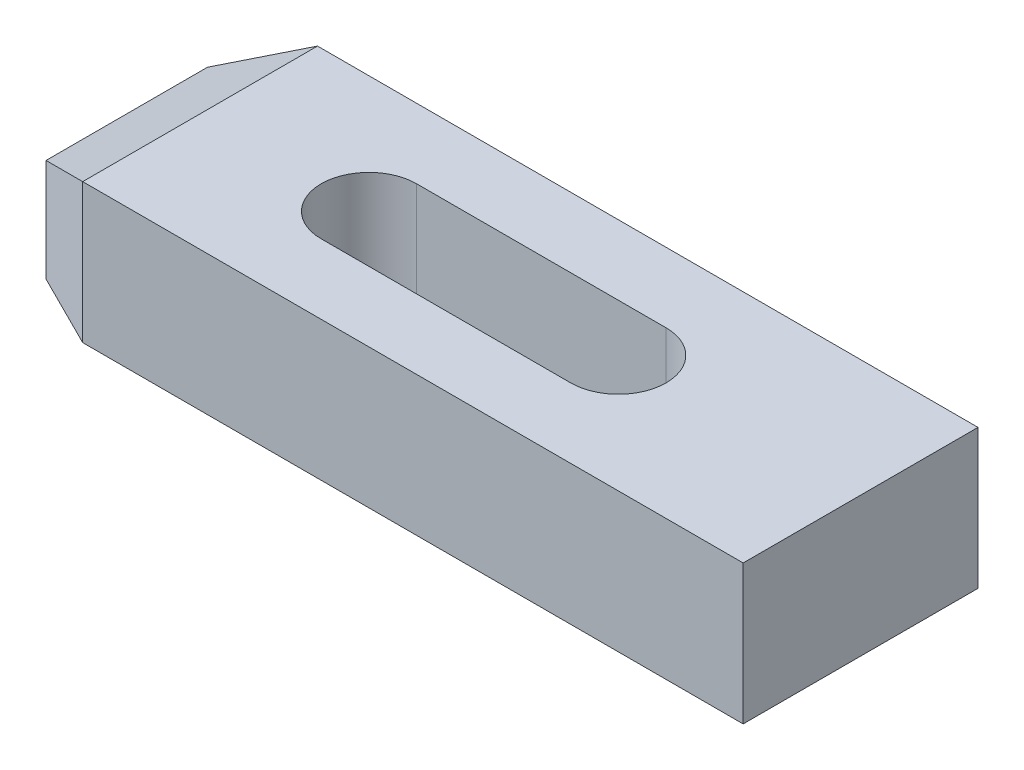
ISO-10303-21;
HEADER;
FILE_DESCRIPTION(('STEP AP214'),'2;1');
FILE_NAME('part.step','',(''),(''),'','','');
FILE_SCHEMA(('AUTOMOTIVE_DESIGN { 1 0 10303 214 1 1 1 1 }'));
ENDSEC;
DATA;
#1=APPLICATION_CONTEXT('core data for automotive mechanical design processes');
#2=APPLICATION_PROTOCOL_DEFINITION('international standard','automotive_design',2000,#1);
#3=PRODUCT_CONTEXT('',#1,'mechanical');
#4=PRODUCT('Part','Part','',(#3));
#5=PRODUCT_RELATED_PRODUCT_CATEGORY('part','',(#4));
#6=PRODUCT_DEFINITION_FORMATION('','',#4);
#7=PRODUCT_DEFINITION_CONTEXT('part definition',#1,'design');
#8=PRODUCT_DEFINITION('design','',#6,#7);
#9=PRODUCT_DEFINITION_SHAPE('','',#8);
#10=(LENGTH_UNIT() NAMED_UNIT(*) SI_UNIT(.MILLI.,.METRE.));
#11=(NAMED_UNIT(*) PLANE_ANGLE_UNIT() SI_UNIT($,.RADIAN.));
#12=(NAMED_UNIT(*) SI_UNIT($,.STERADIAN.) SOLID_ANGLE_UNIT());
#13=UNCERTAINTY_MEASURE_WITH_UNIT(LENGTH_MEASURE(1.E-05),#10,'distance_accuracy_value','');
#14=(GEOMETRIC_REPRESENTATION_CONTEXT(3) GLOBAL_UNCERTAINTY_ASSIGNED_CONTEXT((#13)) GLOBAL_UNIT_ASSIGNED_CONTEXT((#10,
#11,#12)) REPRESENTATION_CONTEXT('',''));
#15=CARTESIAN_POINT('',(0.,0.,0.));
#16=DIRECTION('',(0.,0.,1.));
#17=DIRECTION('',(1.,0.,0.));
#18=AXIS2_PLACEMENT_3D('',#15,#16,#17);
#19=CARTESIAN_POINT('',(0.,19.,0.));
#20=DIRECTION('',(0.,-1.,0.));
#21=DIRECTION('',(0.,0.,-1.));
#22=AXIS2_PLACEMENT_3D('',#19,#20,#21);
#23=PLANE('',#22);
#24=DIRECTION('',(-1.,0.,0.));
#25=VECTOR('',#24,1.);
#26=CARTESIAN_POINT('',(-40.,19.,-16.));
#27=LINE('',#26,#25);
#28=CARTESIAN_POINT('',(50.,19.,-16.));
#29=VERTEX_POINT('',#28);
#30=CARTESIAN_POINT('',(-40.,19.,-16.));
#31=VERTEX_POINT('',#30);
#32=EDGE_CURVE('E135',#29,#31,#27,.T.);
#33=ORIENTED_EDGE('',*,*,#32,.T.);
#34=DIRECTION('',(0.,0.,1.));
#35=VECTOR('',#34,1.);
#36=CARTESIAN_POINT('',(-40.,19.,-16.));
#37=LINE('',#36,#35);
#38=CARTESIAN_POINT('',(-40.,19.,16.));
#39=VERTEX_POINT('',#38);
#40=EDGE_CURVE('E115',#31,#39,#37,.T.);
#41=ORIENTED_EDGE('',*,*,#40,.T.);
#42=DIRECTION('',(1.,0.,0.));
#43=VECTOR('',#42,1.);
#44=CARTESIAN_POINT('',(-39.9999999999999,19.,16.));
#45=LINE('',#44,#43);
#46=CARTESIAN_POINT('',(50.,19.,16.));
#47=VERTEX_POINT('',#46);
#48=EDGE_CURVE('E142',#39,#47,#45,.T.);
#49=ORIENTED_EDGE('',*,*,#48,.T.);
#50=DIRECTION('',(0.,0.,-1.));
#51=VECTOR('',#50,1.);
#52=CARTESIAN_POINT('',(50.,19.,16.));
#53=LINE('',#52,#51);
#54=EDGE_CURVE('E138',#47,#29,#53,.T.);
#55=ORIENTED_EDGE('',*,*,#54,.T.);
#56=EDGE_LOOP('',(#33,#41,#49,#55));
#57=FACE_BOUND('',#56,.T.);
#58=CARTESIAN_POINT('',(-17.,19.,0.));
#59=DIRECTION('',(0.,1.,0.));
#60=DIRECTION('',(0.,0.,1.));
#61=AXIS2_PLACEMENT_3D('',#58,#59,#60);
#62=CIRCLE('',#61,6.5);
#63=CARTESIAN_POINT('',(-17.,19.,-6.5));
#64=VERTEX_POINT('',#63);
#65=CARTESIAN_POINT('',(-17.,19.,6.5));
#66=VERTEX_POINT('',#65);
#67=EDGE_CURVE('E185',#64,#66,#62,.T.);
#68=ORIENTED_EDGE('',*,*,#67,.F.);
#69=DIRECTION('',(-1.,0.,0.));
#70=VECTOR('',#69,1.);
#71=CARTESIAN_POINT('',(-17.,19.,-6.5));
#72=LINE('',#71,#70);
#73=CARTESIAN_POINT('',(17.,19.,-6.50000000000001));
#74=VERTEX_POINT('',#73);
#75=EDGE_CURVE('E181',#74,#64,#72,.T.);
#76=ORIENTED_EDGE('',*,*,#75,.F.);
#77=CARTESIAN_POINT('',(17.,19.,0.));
#78=DIRECTION('',(0.,1.,0.));
#79=DIRECTION('',(0.,0.,1.));
#80=AXIS2_PLACEMENT_3D('',#77,#78,#79);
#81=CIRCLE('',#80,6.5);
#82=CARTESIAN_POINT('',(17.,19.,6.49999999999999));
#83=VERTEX_POINT('',#82);
#84=EDGE_CURVE('E195',#83,#74,#81,.T.);
#85=ORIENTED_EDGE('',*,*,#84,.F.);
#86=DIRECTION('',(1.,0.,0.));
#87=VECTOR('',#86,1.);
#88=CARTESIAN_POINT('',(-17.,19.,6.5));
#89=LINE('',#88,#87);
#90=EDGE_CURVE('E197',#66,#83,#89,.T.);
#91=ORIENTED_EDGE('',*,*,#90,.F.);
#92=EDGE_LOOP('',(#68,#76,#85,#91));
#93=FACE_BOUND('',#92,.T.);
#94=ADVANCED_FACE('F41',(#57,#93),#23,.F.);
#95=CARTESIAN_POINT('',(0.,0.,0.));
#96=DIRECTION('',(0.,-1.,0.));
#97=DIRECTION('',(0.,0.,-1.));
#98=AXIS2_PLACEMENT_3D('',#95,#96,#97);
#99=PLANE('',#98);
#100=DIRECTION('',(0.,0.,-1.));
#101=VECTOR('',#100,1.);
#102=CARTESIAN_POINT('',(50.,0.,16.));
#103=LINE('',#102,#101);
#104=CARTESIAN_POINT('',(50.,0.,16.));
#105=VERTEX_POINT('',#104);
#106=CARTESIAN_POINT('',(50.,0.,-16.));
#107=VERTEX_POINT('',#106);
#108=EDGE_CURVE('E167',#105,#107,#103,.T.);
#109=ORIENTED_EDGE('',*,*,#108,.F.);
#110=DIRECTION('',(1.,0.,0.));
#111=VECTOR('',#110,1.);
#112=CARTESIAN_POINT('',(-39.9999999999999,0.,16.));
#113=LINE('',#112,#111);
#114=CARTESIAN_POINT('',(-39.9999999999999,0.,16.));
#115=VERTEX_POINT('',#114);
#116=EDGE_CURVE('E157',#115,#105,#113,.T.);
#117=ORIENTED_EDGE('',*,*,#116,.F.);
#118=DIRECTION('',(0.894427190999916,0.,0.447213595499957));
#119=VECTOR('',#118,1.);
#120=CARTESIAN_POINT('',(-39.9999999999999,0.,16.));
#121=LINE('',#120,#119);
#122=CARTESIAN_POINT('',(-50.,0.,11.));
#123=VERTEX_POINT('',#122);
#124=EDGE_CURVE('E159',#123,#115,#121,.T.);
#125=ORIENTED_EDGE('',*,*,#124,.F.);
#126=DIRECTION('',(0.,0.,1.));
#127=VECTOR('',#126,1.);
#128=CARTESIAN_POINT('',(-50.,0.,11.));
#129=LINE('',#128,#127);
#130=CARTESIAN_POINT('',(-50.,0.,-11.));
#131=VERTEX_POINT('',#130);
#132=EDGE_CURVE('E161',#131,#123,#129,.T.);
#133=ORIENTED_EDGE('',*,*,#132,.F.);
#134=DIRECTION('',(-0.894427190999916,0.,0.447213595499958));
#135=VECTOR('',#134,1.);
#136=CARTESIAN_POINT('',(-40.,0.,-16.));
#137=LINE('',#136,#135);
#138=CARTESIAN_POINT('',(-40.,0.,-16.));
#139=VERTEX_POINT('',#138);
#140=EDGE_CURVE('E164',#139,#131,#137,.T.);
#141=ORIENTED_EDGE('',*,*,#140,.F.);
#142=DIRECTION('',(-1.,0.,0.));
#143=VECTOR('',#142,1.);
#144=CARTESIAN_POINT('',(-40.,0.,-16.));
#145=LINE('',#144,#143);
#146=EDGE_CURVE('E145',#107,#139,#145,.T.);
#147=ORIENTED_EDGE('',*,*,#146,.F.);
#148=EDGE_LOOP('',(#109,#117,#125,#133,#141,#147));
#149=FACE_BOUND('',#148,.T.);
#150=DIRECTION('',(-1.,0.,0.));
#151=VECTOR('',#150,1.);
#152=CARTESIAN_POINT('',(-17.,0.,-6.5));
#153=LINE('',#152,#151);
#154=CARTESIAN_POINT('',(17.,0.,-6.50000000000001));
#155=VERTEX_POINT('',#154);
#156=CARTESIAN_POINT('',(-17.,0.,-6.5));
#157=VERTEX_POINT('',#156);
#158=EDGE_CURVE('E182',#155,#157,#153,.T.);
#159=ORIENTED_EDGE('',*,*,#158,.T.);
#160=CARTESIAN_POINT('',(-17.,0.,0.));
#161=DIRECTION('',(0.,1.,0.));
#162=DIRECTION('',(0.,0.,1.));
#163=AXIS2_PLACEMENT_3D('',#160,#161,#162);
#164=CIRCLE('',#163,6.5);
#165=CARTESIAN_POINT('',(-17.,0.,6.5));
#166=VERTEX_POINT('',#165);
#167=EDGE_CURVE('E132',#157,#166,#164,.T.);
#168=ORIENTED_EDGE('',*,*,#167,.T.);
#169=DIRECTION('',(1.,0.,0.));
#170=VECTOR('',#169,1.);
#171=CARTESIAN_POINT('',(-17.,0.,6.5));
#172=LINE('',#171,#170);
#173=CARTESIAN_POINT('',(17.,0.,6.49999999999999));
#174=VERTEX_POINT('',#173);
#175=EDGE_CURVE('E189',#166,#174,#172,.T.);
#176=ORIENTED_EDGE('',*,*,#175,.T.);
#177=CARTESIAN_POINT('',(17.,0.,0.));
#178=DIRECTION('',(0.,1.,0.));
#179=DIRECTION('',(0.,0.,1.));
#180=AXIS2_PLACEMENT_3D('',#177,#178,#179);
#181=CIRCLE('',#180,6.5);
#182=EDGE_CURVE('E186',#174,#155,#181,.T.);
#183=ORIENTED_EDGE('',*,*,#182,.T.);
#184=EDGE_LOOP('',(#159,#168,#176,#183));
#185=FACE_BOUND('',#184,.T.);
#186=ADVANCED_FACE('F215',(#149,#185),#99,.T.);
#187=CARTESIAN_POINT('',(50.,19.,16.));
#188=DIRECTION('',(-1.,0.,0.));
#189=DIRECTION('',(0.,0.,1.));
#190=AXIS2_PLACEMENT_3D('',#187,#188,#189);
#191=PLANE('',#190);
#192=ORIENTED_EDGE('',*,*,#108,.T.);
#193=DIRECTION('',(0.,-1.,0.));
#194=VECTOR('',#193,1.);
#195=CARTESIAN_POINT('',(50.,19.,-16.));
#196=LINE('',#195,#194);
#197=EDGE_CURVE('E49',#29,#107,#196,.T.);
#198=ORIENTED_EDGE('',*,*,#197,.F.);
#199=ORIENTED_EDGE('',*,*,#54,.F.);
#200=DIRECTION('',(0.,-1.,0.));
#201=VECTOR('',#200,1.);
#202=CARTESIAN_POINT('',(50.,19.,16.));
#203=LINE('',#202,#201);
#204=EDGE_CURVE('E154',#47,#105,#203,.T.);
#205=ORIENTED_EDGE('',*,*,#204,.T.);
#206=EDGE_LOOP('',(#192,#198,#199,#205));
#207=FACE_BOUND('',#206,.T.);
#208=ADVANCED_FACE('F43',(#207),#191,.F.);
#209=CARTESIAN_POINT('',(-40.,19.,-16.));
#210=DIRECTION('',(0.,0.,1.));
#211=DIRECTION('',(1.,0.,0.));
#212=AXIS2_PLACEMENT_3D('',#209,#210,#211);
#213=PLANE('',#212);
#214=ORIENTED_EDGE('',*,*,#146,.T.);
#215=DIRECTION('',(0.,-1.,0.));
#216=VECTOR('',#215,1.);
#217=CARTESIAN_POINT('',(-40.,19.,-16.));
#218=LINE('',#217,#216);
#219=EDGE_CURVE('E129',#31,#139,#218,.T.);
#220=ORIENTED_EDGE('',*,*,#219,.F.);
#221=ORIENTED_EDGE('',*,*,#32,.F.);
#222=ORIENTED_EDGE('',*,*,#197,.T.);
#223=EDGE_LOOP('',(#214,#220,#221,#222));
#224=FACE_BOUND('',#223,.T.);
#225=ADVANCED_FACE('F144',(#224),#213,.F.);
#226=CARTESIAN_POINT('',(-40.,19.,-16.));
#227=DIRECTION('',(0.447213595499958,0.,0.894427190999916));
#228=DIRECTION('',(0.894427190999916,0.,-0.447213595499958));
#229=AXIS2_PLACEMENT_3D('',#226,#227,#228);
#230=PLANE('',#229);
#231=DIRECTION('',(0.,-1.,0.));
#232=VECTOR('',#231,1.);
#233=CARTESIAN_POINT('',(-50.,19.,-11.));
#234=LINE('',#233,#232);
#235=CARTESIAN_POINT('',(-50.,14.,-11.));
#236=VERTEX_POINT('',#235);
#237=EDGE_CURVE('E131',#236,#131,#234,.T.);
#238=ORIENTED_EDGE('',*,*,#237,.F.);
#239=DIRECTION('',(0.816496580927726,0.408248290463863,-0.408248290463864));
#240=VECTOR('',#239,1.);
#241=CARTESIAN_POINT('',(-40.,19.,-16.));
#242=LINE('',#241,#240);
#243=EDGE_CURVE('E118',#236,#31,#242,.T.);
#244=ORIENTED_EDGE('',*,*,#243,.T.);
#245=ORIENTED_EDGE('',*,*,#219,.T.);
#246=ORIENTED_EDGE('',*,*,#140,.T.);
#247=EDGE_LOOP('',(#238,#244,#245,#246));
#248=FACE_BOUND('',#247,.T.);
#249=ADVANCED_FACE('F126',(#248),#230,.F.);
#250=CARTESIAN_POINT('',(-50.,19.,11.));
#251=DIRECTION('',(1.,0.,0.));
#252=DIRECTION('',(0.,0.,-1.));
#253=AXIS2_PLACEMENT_3D('',#250,#251,#252);
#254=PLANE('',#253);
#255=DIRECTION('',(0.,-1.,0.));
#256=VECTOR('',#255,1.);
#257=CARTESIAN_POINT('',(-50.,19.,11.));
#258=LINE('',#257,#256);
#259=CARTESIAN_POINT('',(-50.,14.,11.));
#260=VERTEX_POINT('',#259);
#261=EDGE_CURVE('E147',#260,#123,#258,.T.);
#262=ORIENTED_EDGE('',*,*,#261,.F.);
#263=DIRECTION('',(0.,0.,1.));
#264=VECTOR('',#263,1.);
#265=CARTESIAN_POINT('',(-50.,14.,-16.));
#266=LINE('',#265,#264);
#267=EDGE_CURVE('E56',#236,#260,#266,.T.);
#268=ORIENTED_EDGE('',*,*,#267,.F.);
#269=ORIENTED_EDGE('',*,*,#237,.T.);
#270=ORIENTED_EDGE('',*,*,#132,.T.);
#271=EDGE_LOOP('',(#262,#268,#269,#270));
#272=FACE_BOUND('',#271,.T.);
#273=ADVANCED_FACE('F243',(#272),#254,.F.);
#274=CARTESIAN_POINT('',(-39.9999999999999,19.,16.));
#275=DIRECTION('',(0.447213595499957,0.,-0.894427190999917));
#276=DIRECTION('',(-0.894427190999917,0.,-0.447213595499957));
#277=AXIS2_PLACEMENT_3D('',#274,#275,#276);
#278=PLANE('',#277);
#279=DIRECTION('',(0.,-1.,0.));
#280=VECTOR('',#279,1.);
#281=CARTESIAN_POINT('',(-39.9999999999999,19.,16.));
#282=LINE('',#281,#280);
#283=EDGE_CURVE('E151',#39,#115,#282,.T.);
#284=ORIENTED_EDGE('',*,*,#283,.F.);
#285=DIRECTION('',(-0.816496580927727,-0.408248290463863,-0.408248290463862));
#286=VECTOR('',#285,1.);
#287=CARTESIAN_POINT('',(-40.,19.,16.));
#288=LINE('',#287,#286);
#289=EDGE_CURVE('E12',#39,#260,#288,.T.);
#290=ORIENTED_EDGE('',*,*,#289,.T.);
#291=ORIENTED_EDGE('',*,*,#261,.T.);
#292=ORIENTED_EDGE('',*,*,#124,.T.);
#293=EDGE_LOOP('',(#284,#290,#291,#292));
#294=FACE_BOUND('',#293,.T.);
#295=ADVANCED_FACE('F239',(#294),#278,.F.);
#296=CARTESIAN_POINT('',(-39.9999999999999,19.,16.));
#297=DIRECTION('',(0.,0.,-1.));
#298=DIRECTION('',(-1.,0.,0.));
#299=AXIS2_PLACEMENT_3D('',#296,#297,#298);
#300=PLANE('',#299);
#301=ORIENTED_EDGE('',*,*,#116,.T.);
#302=ORIENTED_EDGE('',*,*,#204,.F.);
#303=ORIENTED_EDGE('',*,*,#48,.F.);
#304=ORIENTED_EDGE('',*,*,#283,.T.);
#305=EDGE_LOOP('',(#301,#302,#303,#304));
#306=FACE_BOUND('',#305,.T.);
#307=ADVANCED_FACE('F236',(#306),#300,.F.);
#308=CARTESIAN_POINT('',(-17.,19.,0.));
#309=DIRECTION('',(0.,-1.,0.));
#310=DIRECTION('',(0.,0.,-1.));
#311=AXIS2_PLACEMENT_3D('',#308,#309,#310);
#312=CYLINDRICAL_SURFACE('',#311,6.5);
#313=ORIENTED_EDGE('',*,*,#167,.F.);
#314=DIRECTION('',(0.,-1.,0.));
#315=VECTOR('',#314,1.);
#316=CARTESIAN_POINT('',(-17.,19.,-6.5));
#317=LINE('',#316,#315);
#318=EDGE_CURVE('E178',#64,#157,#317,.T.);
#319=ORIENTED_EDGE('',*,*,#318,.F.);
#320=ORIENTED_EDGE('',*,*,#67,.T.);
#321=DIRECTION('',(0.,-1.,0.));
#322=VECTOR('',#321,1.);
#323=CARTESIAN_POINT('',(-17.,19.,6.5));
#324=LINE('',#323,#322);
#325=EDGE_CURVE('E170',#66,#166,#324,.T.);
#326=ORIENTED_EDGE('',*,*,#325,.T.);
#327=EDGE_LOOP('',(#313,#319,#320,#326));
#328=FACE_BOUND('',#327,.T.);
#329=ADVANCED_FACE('F204',(#328),#312,.F.);
#330=CARTESIAN_POINT('',(-17.,19.,6.5));
#331=DIRECTION('',(0.,0.,-1.));
#332=DIRECTION('',(-1.,0.,0.));
#333=AXIS2_PLACEMENT_3D('',#330,#331,#332);
#334=PLANE('',#333);
#335=ORIENTED_EDGE('',*,*,#175,.F.);
#336=ORIENTED_EDGE('',*,*,#325,.F.);
#337=ORIENTED_EDGE('',*,*,#90,.T.);
#338=DIRECTION('',(0.,-1.,0.));
#339=VECTOR('',#338,1.);
#340=CARTESIAN_POINT('',(17.,19.,6.49999999999999));
#341=LINE('',#340,#339);
#342=EDGE_CURVE('E175',#83,#174,#341,.T.);
#343=ORIENTED_EDGE('',*,*,#342,.T.);
#344=EDGE_LOOP('',(#335,#336,#337,#343));
#345=FACE_BOUND('',#344,.T.);
#346=ADVANCED_FACE('F208',(#345),#334,.T.);
#347=CARTESIAN_POINT('',(17.,19.,0.));
#348=DIRECTION('',(0.,-1.,0.));
#349=DIRECTION('',(0.,0.,-1.));
#350=AXIS2_PLACEMENT_3D('',#347,#348,#349);
#351=CYLINDRICAL_SURFACE('',#350,6.5);
#352=ORIENTED_EDGE('',*,*,#182,.F.);
#353=ORIENTED_EDGE('',*,*,#342,.F.);
#354=ORIENTED_EDGE('',*,*,#84,.T.);
#355=DIRECTION('',(0.,-1.,0.));
#356=VECTOR('',#355,1.);
#357=CARTESIAN_POINT('',(17.,19.,-6.50000000000001));
#358=LINE('',#357,#356);
#359=EDGE_CURVE('E63',#74,#155,#358,.T.);
#360=ORIENTED_EDGE('',*,*,#359,.T.);
#361=EDGE_LOOP('',(#352,#353,#354,#360));
#362=FACE_BOUND('',#361,.T.);
#363=ADVANCED_FACE('F213',(#362),#351,.F.);
#364=CARTESIAN_POINT('',(-17.,19.,-6.5));
#365=DIRECTION('',(0.,0.,1.));
#366=DIRECTION('',(1.,0.,0.));
#367=AXIS2_PLACEMENT_3D('',#364,#365,#366);
#368=PLANE('',#367);
#369=ORIENTED_EDGE('',*,*,#158,.F.);
#370=ORIENTED_EDGE('',*,*,#359,.F.);
#371=ORIENTED_EDGE('',*,*,#75,.T.);
#372=ORIENTED_EDGE('',*,*,#318,.T.);
#373=EDGE_LOOP('',(#369,#370,#371,#372));
#374=FACE_BOUND('',#373,.T.);
#375=ADVANCED_FACE('F216',(#374),#368,.T.);
#376=CARTESIAN_POINT('',(-40.,19.,-16.));
#377=DIRECTION('',(0.447213595499958,-0.894427190999916,0.));
#378=DIRECTION('',(0.894427190999916,0.447213595499958,0.));
#379=AXIS2_PLACEMENT_3D('',#376,#377,#378);
#380=PLANE('',#379);
#381=ORIENTED_EDGE('',*,*,#267,.T.);
#382=ORIENTED_EDGE('',*,*,#289,.F.);
#383=ORIENTED_EDGE('',*,*,#40,.F.);
#384=ORIENTED_EDGE('',*,*,#243,.F.);
#385=EDGE_LOOP('',(#381,#382,#383,#384));
#386=FACE_BOUND('',#385,.T.);
#387=ADVANCED_FACE('F117',(#386),#380,.F.);
#388=CLOSED_SHELL('',(#94,#186,#208,#225,#249,#273,#295,#307,#329,#346,#363,#375,#387));
#389=MANIFOLD_SOLID_BREP('B2',#388);
#390=ADVANCED_BREP_SHAPE_REPRESENTATION('',(#18,#389),#14);
#391=SHAPE_DEFINITION_REPRESENTATION(#9,#390);
ENDSEC;
END-ISO-10303-21;
